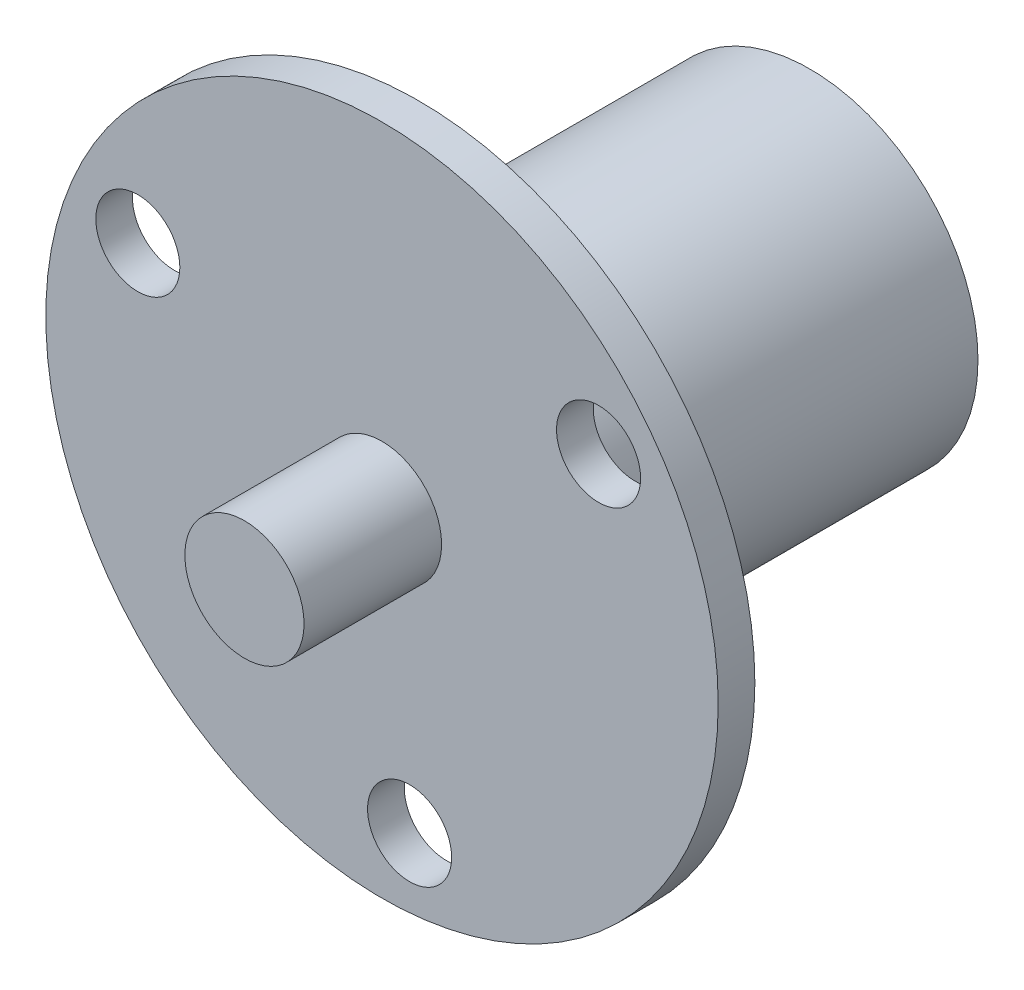
ISO-10303-21;
HEADER;
FILE_DESCRIPTION(('STEP AP214'),'2;1');
FILE_NAME('part.step','',(''),(''),'','','');
FILE_SCHEMA(('AUTOMOTIVE_DESIGN { 1 0 10303 214 1 1 1 1 }'));
ENDSEC;
DATA;
#1=APPLICATION_CONTEXT('core data for automotive mechanical design processes');
#2=APPLICATION_PROTOCOL_DEFINITION('international standard','automotive_design',2000,#1);
#3=PRODUCT_CONTEXT('',#1,'mechanical');
#4=PRODUCT('Part','Part','',(#3));
#5=PRODUCT_RELATED_PRODUCT_CATEGORY('part','',(#4));
#6=PRODUCT_DEFINITION_FORMATION('','',#4);
#7=PRODUCT_DEFINITION_CONTEXT('part definition',#1,'design');
#8=PRODUCT_DEFINITION('design','',#6,#7);
#9=PRODUCT_DEFINITION_SHAPE('','',#8);
#10=(LENGTH_UNIT() NAMED_UNIT(*) SI_UNIT(.MILLI.,.METRE.));
#11=(NAMED_UNIT(*) PLANE_ANGLE_UNIT() SI_UNIT($,.RADIAN.));
#12=(NAMED_UNIT(*) SI_UNIT($,.STERADIAN.) SOLID_ANGLE_UNIT());
#13=UNCERTAINTY_MEASURE_WITH_UNIT(LENGTH_MEASURE(1.E-05),#10,'distance_accuracy_value','');
#14=(GEOMETRIC_REPRESENTATION_CONTEXT(3) GLOBAL_UNCERTAINTY_ASSIGNED_CONTEXT((#13)) GLOBAL_UNIT_ASSIGNED_CONTEXT((#10,
#11,#12)) REPRESENTATION_CONTEXT('',''));
#15=CARTESIAN_POINT('',(0.,0.,0.));
#16=DIRECTION('',(0.,0.,1.));
#17=DIRECTION('',(1.,0.,0.));
#18=AXIS2_PLACEMENT_3D('',#15,#16,#17);
#19=CARTESIAN_POINT('',(0.,0.,25.6));
#20=DIRECTION('',(0.,0.,-1.));
#21=DIRECTION('',(-1.,0.,0.));
#22=AXIS2_PLACEMENT_3D('',#19,#20,#21);
#23=CYLINDRICAL_SURFACE('',#22,11.);
#24=CARTESIAN_POINT('',(0.,0.,25.6));
#25=DIRECTION('',(0.,0.,1.));
#26=DIRECTION('',(1.,0.,0.));
#27=AXIS2_PLACEMENT_3D('',#24,#25,#26);
#28=CIRCLE('',#27,11.);
#29=CARTESIAN_POINT('',(11.,0.,25.6));
#30=VERTEX_POINT('',#29);
#31=EDGE_CURVE('E45',#30,#30,#28,.T.);
#32=ORIENTED_EDGE('',*,*,#31,.F.);
#33=EDGE_LOOP('',(#32));
#34=FACE_BOUND('',#33,.T.);
#35=CARTESIAN_POINT('',(0.,0.,0.));
#36=DIRECTION('',(0.,0.,1.));
#37=DIRECTION('',(1.,0.,0.));
#38=AXIS2_PLACEMENT_3D('',#35,#36,#37);
#39=CIRCLE('',#38,11.);
#40=CARTESIAN_POINT('',(11.,0.,0.));
#41=VERTEX_POINT('',#40);
#42=EDGE_CURVE('E51',#41,#41,#39,.T.);
#43=ORIENTED_EDGE('',*,*,#42,.T.);
#44=EDGE_LOOP('',(#43));
#45=FACE_BOUND('',#44,.T.);
#46=ADVANCED_FACE('F37',(#34,#45),#23,.T.);
#47=CARTESIAN_POINT('',(0.,0.,0.));
#48=DIRECTION('',(0.,0.,1.));
#49=DIRECTION('',(1.,0.,0.));
#50=AXIS2_PLACEMENT_3D('',#47,#48,#49);
#51=PLANE('',#50);
#52=ORIENTED_EDGE('',*,*,#42,.F.);
#53=EDGE_LOOP('',(#52));
#54=FACE_BOUND('',#53,.T.);
#55=ADVANCED_FACE('F101',(#54),#51,.F.);
#56=CARTESIAN_POINT('',(0.,0.,28.));
#57=DIRECTION('',(0.,0.,-1.));
#58=DIRECTION('',(-1.,0.,0.));
#59=AXIS2_PLACEMENT_3D('',#56,#57,#58);
#60=CYLINDRICAL_SURFACE('',#59,22.);
#61=CARTESIAN_POINT('',(0.,0.,28.));
#62=DIRECTION('',(0.,0.,1.));
#63=DIRECTION('',(1.,0.,0.));
#64=AXIS2_PLACEMENT_3D('',#61,#62,#63);
#65=CIRCLE('',#64,22.);
#66=CARTESIAN_POINT('',(22.,0.,28.));
#67=VERTEX_POINT('',#66);
#68=EDGE_CURVE('E57',#67,#67,#65,.T.);
#69=ORIENTED_EDGE('',*,*,#68,.F.);
#70=EDGE_LOOP('',(#69));
#71=FACE_BOUND('',#70,.T.);
#72=CARTESIAN_POINT('',(0.,0.,25.6));
#73=DIRECTION('',(0.,0.,1.));
#74=DIRECTION('',(1.,0.,0.));
#75=AXIS2_PLACEMENT_3D('',#72,#73,#74);
#76=CIRCLE('',#75,22.);
#77=CARTESIAN_POINT('',(22.,0.,25.6));
#78=VERTEX_POINT('',#77);
#79=EDGE_CURVE('E61',#78,#78,#76,.T.);
#80=ORIENTED_EDGE('',*,*,#79,.T.);
#81=EDGE_LOOP('',(#80));
#82=FACE_BOUND('',#81,.T.);
#83=ADVANCED_FACE('F106',(#71,#82),#60,.T.);
#84=CARTESIAN_POINT('',(0.,0.,28.));
#85=DIRECTION('',(0.,0.,1.));
#86=DIRECTION('',(1.,0.,0.));
#87=AXIS2_PLACEMENT_3D('',#84,#85,#86);
#88=PLANE('',#87);
#89=CARTESIAN_POINT('',(-15.9778931439305,7.13841233616675,28.));
#90=DIRECTION('',(0.,0.,1.));
#91=DIRECTION('',(1.,0.,0.));
#92=AXIS2_PLACEMENT_3D('',#89,#90,#91);
#93=CIRCLE('',#92,2.75);
#94=CARTESIAN_POINT('',(-13.2278931439305,7.13841233616675,28.));
#95=VERTEX_POINT('',#94);
#96=EDGE_CURVE('E72',#95,#95,#93,.T.);
#97=ORIENTED_EDGE('',*,*,#96,.F.);
#98=EDGE_LOOP('',(#97));
#99=FACE_BOUND('',#98,.T.);
#100=CARTESIAN_POINT('',(14.1709929977738,10.2680551935145,28.));
#101=DIRECTION('',(0.,0.,1.));
#102=DIRECTION('',(1.,0.,0.));
#103=AXIS2_PLACEMENT_3D('',#100,#101,#102);
#104=CIRCLE('',#103,2.75000000000085);
#105=CARTESIAN_POINT('',(16.9209929977747,10.2680551935145,28.));
#106=VERTEX_POINT('',#105);
#107=EDGE_CURVE('E132',#106,#106,#104,.T.);
#108=ORIENTED_EDGE('',*,*,#107,.F.);
#109=EDGE_LOOP('',(#108));
#110=FACE_BOUND('',#109,.T.);
#111=CARTESIAN_POINT('',(1.80690014615734,-17.4064675296799,28.));
#112=DIRECTION('',(0.,0.,1.));
#113=DIRECTION('',(1.,0.,0.));
#114=AXIS2_PLACEMENT_3D('',#111,#112,#113);
#115=CIRCLE('',#114,2.75000000000027);
#116=CARTESIAN_POINT('',(4.55690014615761,-17.4064675296799,28.));
#117=VERTEX_POINT('',#116);
#118=EDGE_CURVE('E136',#117,#117,#115,.T.);
#119=ORIENTED_EDGE('',*,*,#118,.F.);
#120=EDGE_LOOP('',(#119));
#121=FACE_BOUND('',#120,.T.);
#122=CARTESIAN_POINT('',(0.,0.,28.));
#123=DIRECTION('',(0.,0.,1.));
#124=DIRECTION('',(1.,0.,0.));
#125=AXIS2_PLACEMENT_3D('',#122,#123,#124);
#126=CIRCLE('',#125,3.9);
#127=CARTESIAN_POINT('',(3.9,0.,28.));
#128=VERTEX_POINT('',#127);
#129=EDGE_CURVE('E10',#128,#128,#126,.T.);
#130=ORIENTED_EDGE('',*,*,#129,.F.);
#131=EDGE_LOOP('',(#130));
#132=FACE_BOUND('',#131,.T.);
#133=ORIENTED_EDGE('',*,*,#68,.T.);
#134=EDGE_LOOP('',(#133));
#135=FACE_BOUND('',#134,.T.);
#136=ADVANCED_FACE('F97',(#99,#110,#121,#132,#135),#88,.T.);
#137=CARTESIAN_POINT('',(0.,0.,25.6));
#138=DIRECTION('',(0.,0.,1.));
#139=DIRECTION('',(1.,0.,0.));
#140=AXIS2_PLACEMENT_3D('',#137,#138,#139);
#141=PLANE('',#140);
#142=CARTESIAN_POINT('',(-15.9778931439305,7.13841233616675,25.6));
#143=DIRECTION('',(0.,0.,1.));
#144=DIRECTION('',(1.,0.,0.));
#145=AXIS2_PLACEMENT_3D('',#142,#143,#144);
#146=CIRCLE('',#145,2.75);
#147=CARTESIAN_POINT('',(-13.2278931439305,7.13841233616675,25.6));
#148=VERTEX_POINT('',#147);
#149=EDGE_CURVE('E40',#148,#148,#146,.T.);
#150=ORIENTED_EDGE('',*,*,#149,.T.);
#151=EDGE_LOOP('',(#150));
#152=FACE_BOUND('',#151,.T.);
#153=CARTESIAN_POINT('',(14.1709929977738,10.2680551935145,25.6));
#154=DIRECTION('',(0.,0.,1.));
#155=DIRECTION('',(1.,0.,0.));
#156=AXIS2_PLACEMENT_3D('',#153,#154,#155);
#157=CIRCLE('',#156,2.75000000000085);
#158=CARTESIAN_POINT('',(16.9209929977747,10.2680551935145,25.6));
#159=VERTEX_POINT('',#158);
#160=EDGE_CURVE('E71',#159,#159,#157,.T.);
#161=ORIENTED_EDGE('',*,*,#160,.T.);
#162=EDGE_LOOP('',(#161));
#163=FACE_BOUND('',#162,.T.);
#164=CARTESIAN_POINT('',(1.80690014615734,-17.4064675296799,25.6));
#165=DIRECTION('',(0.,0.,1.));
#166=DIRECTION('',(1.,0.,0.));
#167=AXIS2_PLACEMENT_3D('',#164,#165,#166);
#168=CIRCLE('',#167,2.75000000000027);
#169=CARTESIAN_POINT('',(4.55690014615761,-17.4064675296799,25.6));
#170=VERTEX_POINT('',#169);
#171=EDGE_CURVE('E68',#170,#170,#168,.T.);
#172=ORIENTED_EDGE('',*,*,#171,.T.);
#173=EDGE_LOOP('',(#172));
#174=FACE_BOUND('',#173,.T.);
#175=ORIENTED_EDGE('',*,*,#31,.T.);
#176=EDGE_LOOP('',(#175));
#177=FACE_BOUND('',#176,.T.);
#178=ORIENTED_EDGE('',*,*,#79,.F.);
#179=EDGE_LOOP('',(#178));
#180=FACE_BOUND('',#179,.T.);
#181=ADVANCED_FACE('F89',(#152,#163,#174,#177,#180),#141,.F.);
#182=CARTESIAN_POINT('',(0.,0.,37.));
#183=DIRECTION('',(0.,0.,-1.));
#184=DIRECTION('',(-1.,0.,0.));
#185=AXIS2_PLACEMENT_3D('',#182,#183,#184);
#186=CYLINDRICAL_SURFACE('',#185,3.9);
#187=CARTESIAN_POINT('',(0.,0.,37.));
#188=DIRECTION('',(0.,0.,1.));
#189=DIRECTION('',(1.,0.,0.));
#190=AXIS2_PLACEMENT_3D('',#187,#188,#189);
#191=CIRCLE('',#190,3.9);
#192=CARTESIAN_POINT('',(3.9,0.,37.));
#193=VERTEX_POINT('',#192);
#194=EDGE_CURVE('E55',#193,#193,#191,.T.);
#195=ORIENTED_EDGE('',*,*,#194,.F.);
#196=EDGE_LOOP('',(#195));
#197=FACE_BOUND('',#196,.T.);
#198=ORIENTED_EDGE('',*,*,#129,.T.);
#199=EDGE_LOOP('',(#198));
#200=FACE_BOUND('',#199,.T.);
#201=ADVANCED_FACE('F87',(#197,#200),#186,.T.);
#202=CARTESIAN_POINT('',(0.,0.,37.));
#203=DIRECTION('',(0.,0.,1.));
#204=DIRECTION('',(1.,0.,0.));
#205=AXIS2_PLACEMENT_3D('',#202,#203,#204);
#206=PLANE('',#205);
#207=ORIENTED_EDGE('',*,*,#194,.T.);
#208=EDGE_LOOP('',(#207));
#209=FACE_BOUND('',#208,.T.);
#210=ADVANCED_FACE('F85',(#209),#206,.T.);
#211=CARTESIAN_POINT('',(1.80690014615734,-17.4064675296799,19.));
#212=DIRECTION('',(0.,0.,1.));
#213=DIRECTION('',(1.,0.,0.));
#214=AXIS2_PLACEMENT_3D('',#211,#212,#213);
#215=CYLINDRICAL_SURFACE('',#214,2.75000000000027);
#216=ORIENTED_EDGE('',*,*,#118,.T.);
#217=EDGE_LOOP('',(#216));
#218=FACE_BOUND('',#217,.T.);
#219=ORIENTED_EDGE('',*,*,#171,.F.);
#220=EDGE_LOOP('',(#219));
#221=FACE_BOUND('',#220,.T.);
#222=ADVANCED_FACE('F95',(#218,#221),#215,.F.);
#223=CARTESIAN_POINT('',(14.1709929977738,10.2680551935145,19.));
#224=DIRECTION('',(0.,0.,1.));
#225=DIRECTION('',(1.,0.,0.));
#226=AXIS2_PLACEMENT_3D('',#223,#224,#225);
#227=CYLINDRICAL_SURFACE('',#226,2.75000000000085);
#228=ORIENTED_EDGE('',*,*,#107,.T.);
#229=EDGE_LOOP('',(#228));
#230=FACE_BOUND('',#229,.T.);
#231=ORIENTED_EDGE('',*,*,#160,.F.);
#232=EDGE_LOOP('',(#231));
#233=FACE_BOUND('',#232,.T.);
#234=ADVANCED_FACE('F147',(#230,#233),#227,.F.);
#235=CARTESIAN_POINT('',(-15.9778931439305,7.13841233616675,19.));
#236=DIRECTION('',(0.,0.,1.));
#237=DIRECTION('',(1.,0.,0.));
#238=AXIS2_PLACEMENT_3D('',#235,#236,#237);
#239=CYLINDRICAL_SURFACE('',#238,2.75);
#240=ORIENTED_EDGE('',*,*,#96,.T.);
#241=EDGE_LOOP('',(#240));
#242=FACE_BOUND('',#241,.T.);
#243=ORIENTED_EDGE('',*,*,#149,.F.);
#244=EDGE_LOOP('',(#243));
#245=FACE_BOUND('',#244,.T.);
#246=ADVANCED_FACE('F144',(#242,#245),#239,.F.);
#247=CLOSED_SHELL('',(#46,#55,#83,#136,#181,#201,#210,#222,#234,#246));
#248=MANIFOLD_SOLID_BREP('B2',#247);
#249=ADVANCED_BREP_SHAPE_REPRESENTATION('',(#18,#248),#14);
#250=SHAPE_DEFINITION_REPRESENTATION(#9,#249);
ENDSEC;
END-ISO-10303-21;
